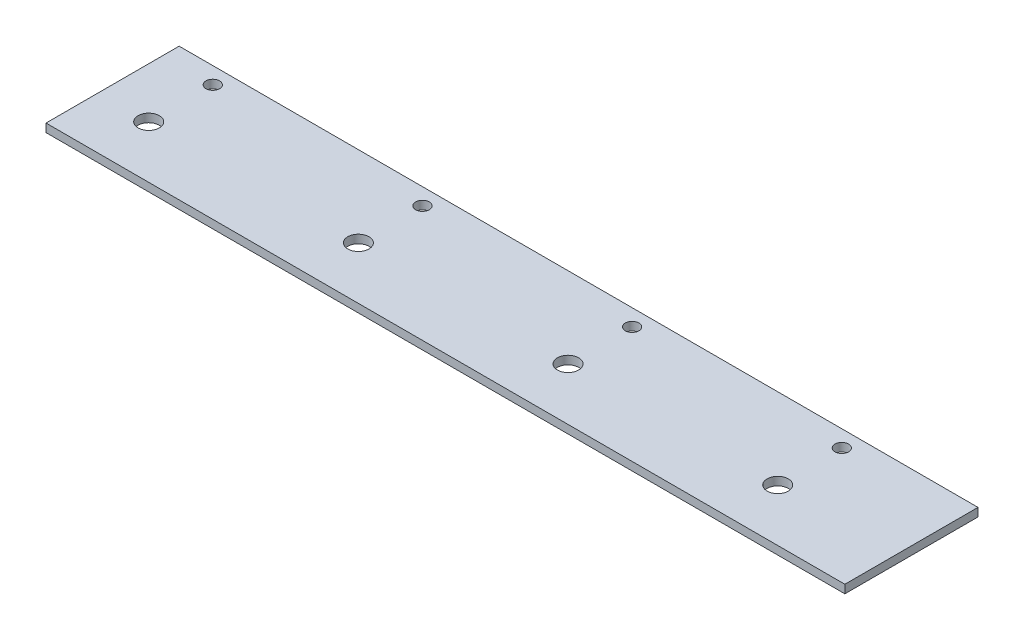
ISO-10303-21;
HEADER;
FILE_DESCRIPTION(('STEP AP214'),'2;1');
FILE_NAME('part.step','',(''),(''),'','','');
FILE_SCHEMA(('AUTOMOTIVE_DESIGN { 1 0 10303 214 1 1 1 1 }'));
ENDSEC;
DATA;
#1=APPLICATION_CONTEXT('core data for automotive mechanical design processes');
#2=APPLICATION_PROTOCOL_DEFINITION('international standard','automotive_design',2000,#1);
#3=PRODUCT_CONTEXT('',#1,'mechanical');
#4=PRODUCT('Part','Part','',(#3));
#5=PRODUCT_RELATED_PRODUCT_CATEGORY('part','',(#4));
#6=PRODUCT_DEFINITION_FORMATION('','',#4);
#7=PRODUCT_DEFINITION_CONTEXT('part definition',#1,'design');
#8=PRODUCT_DEFINITION('design','',#6,#7);
#9=PRODUCT_DEFINITION_SHAPE('','',#8);
#10=(LENGTH_UNIT() NAMED_UNIT(*) SI_UNIT(.MILLI.,.METRE.));
#11=(NAMED_UNIT(*) PLANE_ANGLE_UNIT() SI_UNIT($,.RADIAN.));
#12=(NAMED_UNIT(*) SI_UNIT($,.STERADIAN.) SOLID_ANGLE_UNIT());
#13=UNCERTAINTY_MEASURE_WITH_UNIT(LENGTH_MEASURE(1.E-05),#10,'distance_accuracy_value','');
#14=(GEOMETRIC_REPRESENTATION_CONTEXT(3) GLOBAL_UNCERTAINTY_ASSIGNED_CONTEXT((#13)) GLOBAL_UNIT_ASSIGNED_CONTEXT((#10,
#11,#12)) REPRESENTATION_CONTEXT('',''));
#15=CARTESIAN_POINT('',(0.,0.,0.));
#16=DIRECTION('',(0.,0.,1.));
#17=DIRECTION('',(1.,0.,0.));
#18=AXIS2_PLACEMENT_3D('',#15,#16,#17);
#19=CARTESIAN_POINT('',(0.,3.175,0.));
#20=DIRECTION('',(0.,-1.,0.));
#21=DIRECTION('',(0.,0.,-1.));
#22=AXIS2_PLACEMENT_3D('',#19,#20,#21);
#23=PLANE('',#22);
#24=DIRECTION('',(0.,0.,1.));
#25=VECTOR('',#24,1.);
#26=CARTESIAN_POINT('',(0.,3.175,0.));
#27=LINE('',#26,#25);
#28=CARTESIAN_POINT('',(0.,3.175,-50.8));
#29=VERTEX_POINT('',#28);
#30=CARTESIAN_POINT('',(0.,3.175,0.));
#31=VERTEX_POINT('',#30);
#32=EDGE_CURVE('E85',#29,#31,#27,.T.);
#33=ORIENTED_EDGE('',*,*,#32,.T.);
#34=DIRECTION('',(1.,0.,0.));
#35=VECTOR('',#34,1.);
#36=CARTESIAN_POINT('',(0.,3.175,0.));
#37=LINE('',#36,#35);
#38=CARTESIAN_POINT('',(304.8,3.175,0.));
#39=VERTEX_POINT('',#38);
#40=EDGE_CURVE('E80',#31,#39,#37,.T.);
#41=ORIENTED_EDGE('',*,*,#40,.T.);
#42=DIRECTION('',(0.,0.,-1.));
#43=VECTOR('',#42,1.);
#44=CARTESIAN_POINT('',(304.8,3.175,0.));
#45=LINE('',#44,#43);
#46=CARTESIAN_POINT('',(304.8,3.175,-50.8));
#47=VERTEX_POINT('',#46);
#48=EDGE_CURVE('E83',#39,#47,#45,.T.);
#49=ORIENTED_EDGE('',*,*,#48,.T.);
#50=DIRECTION('',(-1.,0.,0.));
#51=VECTOR('',#50,1.);
#52=CARTESIAN_POINT('',(0.,3.175,-50.8));
#53=LINE('',#52,#51);
#54=EDGE_CURVE('E50',#47,#29,#53,.T.);
#55=ORIENTED_EDGE('',*,*,#54,.T.);
#56=EDGE_LOOP('',(#33,#41,#49,#55));
#57=FACE_BOUND('',#56,.T.);
#58=CARTESIAN_POINT('',(19.1851278989688,3.175,-44.45));
#59=DIRECTION('',(0.,1.,0.));
#60=DIRECTION('',(0.,0.,1.));
#61=AXIS2_PLACEMENT_3D('',#58,#59,#60);
#62=CIRCLE('',#61,2.6);
#63=CARTESIAN_POINT('',(19.1851278989688,3.175,-41.85));
#64=VERTEX_POINT('',#63);
#65=EDGE_CURVE('E100',#64,#64,#62,.T.);
#66=ORIENTED_EDGE('',*,*,#65,.F.);
#67=EDGE_LOOP('',(#66));
#68=FACE_BOUND('',#67,.T.);
#69=CARTESIAN_POINT('',(19.1851278989688,3.175,-20.));
#70=DIRECTION('',(0.,1.,0.));
#71=DIRECTION('',(0.,0.,1.));
#72=AXIS2_PLACEMENT_3D('',#69,#70,#71);
#73=CIRCLE('',#72,4.05);
#74=CARTESIAN_POINT('',(19.1851278989688,3.175,-15.95));
#75=VERTEX_POINT('',#74);
#76=EDGE_CURVE('E115',#75,#75,#73,.T.);
#77=ORIENTED_EDGE('',*,*,#76,.F.);
#78=EDGE_LOOP('',(#77));
#79=FACE_BOUND('',#78,.T.);
#80=CARTESIAN_POINT('',(99.1851278989688,3.175,-44.45));
#81=DIRECTION('',(0.,1.,0.));
#82=DIRECTION('',(0.,0.,1.));
#83=AXIS2_PLACEMENT_3D('',#80,#81,#82);
#84=CIRCLE('',#83,2.6);
#85=CARTESIAN_POINT('',(99.1851278989688,3.175,-41.85));
#86=VERTEX_POINT('',#85);
#87=EDGE_CURVE('E121',#86,#86,#84,.T.);
#88=ORIENTED_EDGE('',*,*,#87,.F.);
#89=EDGE_LOOP('',(#88));
#90=FACE_BOUND('',#89,.T.);
#91=CARTESIAN_POINT('',(99.1851278989688,3.175,-20.));
#92=DIRECTION('',(0.,1.,0.));
#93=DIRECTION('',(0.,0.,1.));
#94=AXIS2_PLACEMENT_3D('',#91,#92,#93);
#95=CIRCLE('',#94,4.04999999999999);
#96=CARTESIAN_POINT('',(99.1851278989688,3.175,-15.95));
#97=VERTEX_POINT('',#96);
#98=EDGE_CURVE('E127',#97,#97,#95,.T.);
#99=ORIENTED_EDGE('',*,*,#98,.F.);
#100=EDGE_LOOP('',(#99));
#101=FACE_BOUND('',#100,.T.);
#102=CARTESIAN_POINT('',(179.185127898969,3.175,-44.45));
#103=DIRECTION('',(0.,1.,0.));
#104=DIRECTION('',(0.,0.,1.));
#105=AXIS2_PLACEMENT_3D('',#102,#103,#104);
#106=CIRCLE('',#105,2.59999999999999);
#107=CARTESIAN_POINT('',(179.185127898969,3.175,-41.85));
#108=VERTEX_POINT('',#107);
#109=EDGE_CURVE('E133',#108,#108,#106,.T.);
#110=ORIENTED_EDGE('',*,*,#109,.F.);
#111=EDGE_LOOP('',(#110));
#112=FACE_BOUND('',#111,.T.);
#113=CARTESIAN_POINT('',(179.185127898969,3.175,-20.));
#114=DIRECTION('',(0.,1.,0.));
#115=DIRECTION('',(0.,0.,1.));
#116=AXIS2_PLACEMENT_3D('',#113,#114,#115);
#117=CIRCLE('',#116,4.04999999999999);
#118=CARTESIAN_POINT('',(179.185127898969,3.175,-15.95));
#119=VERTEX_POINT('',#118);
#120=EDGE_CURVE('E139',#119,#119,#117,.T.);
#121=ORIENTED_EDGE('',*,*,#120,.F.);
#122=EDGE_LOOP('',(#121));
#123=FACE_BOUND('',#122,.T.);
#124=CARTESIAN_POINT('',(259.185127898969,3.175,-44.45));
#125=DIRECTION('',(0.,1.,0.));
#126=DIRECTION('',(0.,0.,1.));
#127=AXIS2_PLACEMENT_3D('',#124,#125,#126);
#128=CIRCLE('',#127,2.60000000000002);
#129=CARTESIAN_POINT('',(259.185127898969,3.175,-41.85));
#130=VERTEX_POINT('',#129);
#131=EDGE_CURVE('E145',#130,#130,#128,.T.);
#132=ORIENTED_EDGE('',*,*,#131,.F.);
#133=EDGE_LOOP('',(#132));
#134=FACE_BOUND('',#133,.T.);
#135=CARTESIAN_POINT('',(259.185127898969,3.175,-20.));
#136=DIRECTION('',(0.,1.,0.));
#137=DIRECTION('',(0.,0.,1.));
#138=AXIS2_PLACEMENT_3D('',#135,#136,#137);
#139=CIRCLE('',#138,4.05000000000002);
#140=CARTESIAN_POINT('',(259.185127898969,3.175,-15.95));
#141=VERTEX_POINT('',#140);
#142=EDGE_CURVE('E151',#141,#141,#139,.T.);
#143=ORIENTED_EDGE('',*,*,#142,.F.);
#144=EDGE_LOOP('',(#143));
#145=FACE_BOUND('',#144,.T.);
#146=ADVANCED_FACE('F33',(#57,#68,#79,#90,#101,#112,#123,#134,#145),#23,.F.);
#147=CARTESIAN_POINT('',(0.,0.,0.));
#148=DIRECTION('',(0.,-1.,0.));
#149=DIRECTION('',(0.,0.,-1.));
#150=AXIS2_PLACEMENT_3D('',#147,#148,#149);
#151=PLANE('',#150);
#152=CARTESIAN_POINT('',(259.185127898969,0.,-44.45));
#153=DIRECTION('',(0.,1.,0.));
#154=DIRECTION('',(0.,0.,1.));
#155=AXIS2_PLACEMENT_3D('',#152,#153,#154);
#156=CIRCLE('',#155,2.60000000000002);
#157=CARTESIAN_POINT('',(259.185127898969,0.,-41.85));
#158=VERTEX_POINT('',#157);
#159=EDGE_CURVE('E148',#158,#158,#156,.T.);
#160=ORIENTED_EDGE('',*,*,#159,.T.);
#161=EDGE_LOOP('',(#160));
#162=FACE_BOUND('',#161,.T.);
#163=CARTESIAN_POINT('',(179.185127898969,0.,-44.45));
#164=DIRECTION('',(0.,1.,0.));
#165=DIRECTION('',(0.,0.,1.));
#166=AXIS2_PLACEMENT_3D('',#163,#164,#165);
#167=CIRCLE('',#166,2.59999999999999);
#168=CARTESIAN_POINT('',(179.185127898969,0.,-41.85));
#169=VERTEX_POINT('',#168);
#170=EDGE_CURVE('E136',#169,#169,#167,.T.);
#171=ORIENTED_EDGE('',*,*,#170,.T.);
#172=EDGE_LOOP('',(#171));
#173=FACE_BOUND('',#172,.T.);
#174=CARTESIAN_POINT('',(99.1851278989688,0.,-44.45));
#175=DIRECTION('',(0.,1.,0.));
#176=DIRECTION('',(0.,0.,1.));
#177=AXIS2_PLACEMENT_3D('',#174,#175,#176);
#178=CIRCLE('',#177,2.6);
#179=CARTESIAN_POINT('',(99.1851278989688,0.,-41.85));
#180=VERTEX_POINT('',#179);
#181=EDGE_CURVE('E124',#180,#180,#178,.T.);
#182=ORIENTED_EDGE('',*,*,#181,.T.);
#183=EDGE_LOOP('',(#182));
#184=FACE_BOUND('',#183,.T.);
#185=CARTESIAN_POINT('',(19.1851278989688,0.,-44.45));
#186=DIRECTION('',(0.,1.,0.));
#187=DIRECTION('',(0.,0.,1.));
#188=AXIS2_PLACEMENT_3D('',#185,#186,#187);
#189=CIRCLE('',#188,2.6);
#190=CARTESIAN_POINT('',(19.1851278989688,0.,-41.85));
#191=VERTEX_POINT('',#190);
#192=EDGE_CURVE('E112',#191,#191,#189,.T.);
#193=ORIENTED_EDGE('',*,*,#192,.T.);
#194=EDGE_LOOP('',(#193));
#195=FACE_BOUND('',#194,.T.);
#196=DIRECTION('',(0.,0.,1.));
#197=VECTOR('',#196,1.);
#198=CARTESIAN_POINT('',(0.,0.,0.));
#199=LINE('',#198,#197);
#200=CARTESIAN_POINT('',(0.,0.,-50.8));
#201=VERTEX_POINT('',#200);
#202=CARTESIAN_POINT('',(0.,0.,0.));
#203=VERTEX_POINT('',#202);
#204=EDGE_CURVE('E97',#201,#203,#199,.T.);
#205=ORIENTED_EDGE('',*,*,#204,.F.);
#206=DIRECTION('',(-1.,0.,0.));
#207=VECTOR('',#206,1.);
#208=CARTESIAN_POINT('',(0.,0.,-50.8));
#209=LINE('',#208,#207);
#210=CARTESIAN_POINT('',(304.8,0.,-50.8));
#211=VERTEX_POINT('',#210);
#212=EDGE_CURVE('E73',#211,#201,#209,.T.);
#213=ORIENTED_EDGE('',*,*,#212,.F.);
#214=DIRECTION('',(0.,0.,-1.));
#215=VECTOR('',#214,1.);
#216=CARTESIAN_POINT('',(304.8,0.,0.));
#217=LINE('',#216,#215);
#218=CARTESIAN_POINT('',(304.8,0.,0.));
#219=VERTEX_POINT('',#218);
#220=EDGE_CURVE('E67',#219,#211,#217,.T.);
#221=ORIENTED_EDGE('',*,*,#220,.F.);
#222=DIRECTION('',(1.,0.,0.));
#223=VECTOR('',#222,1.);
#224=CARTESIAN_POINT('',(0.,0.,0.));
#225=LINE('',#224,#223);
#226=EDGE_CURVE('E89',#203,#219,#225,.T.);
#227=ORIENTED_EDGE('',*,*,#226,.F.);
#228=EDGE_LOOP('',(#205,#213,#221,#227));
#229=FACE_BOUND('',#228,.T.);
#230=CARTESIAN_POINT('',(19.1851278989688,0.,-20.));
#231=DIRECTION('',(0.,1.,0.));
#232=DIRECTION('',(0.,0.,1.));
#233=AXIS2_PLACEMENT_3D('',#230,#231,#232);
#234=CIRCLE('',#233,4.05);
#235=CARTESIAN_POINT('',(19.1851278989688,0.,-15.95));
#236=VERTEX_POINT('',#235);
#237=EDGE_CURVE('E118',#236,#236,#234,.T.);
#238=ORIENTED_EDGE('',*,*,#237,.T.);
#239=EDGE_LOOP('',(#238));
#240=FACE_BOUND('',#239,.T.);
#241=CARTESIAN_POINT('',(99.1851278989688,0.,-20.));
#242=DIRECTION('',(0.,1.,0.));
#243=DIRECTION('',(0.,0.,1.));
#244=AXIS2_PLACEMENT_3D('',#241,#242,#243);
#245=CIRCLE('',#244,4.04999999999999);
#246=CARTESIAN_POINT('',(99.1851278989688,0.,-15.95));
#247=VERTEX_POINT('',#246);
#248=EDGE_CURVE('E130',#247,#247,#245,.T.);
#249=ORIENTED_EDGE('',*,*,#248,.T.);
#250=EDGE_LOOP('',(#249));
#251=FACE_BOUND('',#250,.T.);
#252=CARTESIAN_POINT('',(179.185127898969,0.,-20.));
#253=DIRECTION('',(0.,1.,0.));
#254=DIRECTION('',(0.,0.,1.));
#255=AXIS2_PLACEMENT_3D('',#252,#253,#254);
#256=CIRCLE('',#255,4.04999999999999);
#257=CARTESIAN_POINT('',(179.185127898969,0.,-15.95));
#258=VERTEX_POINT('',#257);
#259=EDGE_CURVE('E142',#258,#258,#256,.T.);
#260=ORIENTED_EDGE('',*,*,#259,.T.);
#261=EDGE_LOOP('',(#260));
#262=FACE_BOUND('',#261,.T.);
#263=CARTESIAN_POINT('',(259.185127898969,0.,-20.));
#264=DIRECTION('',(0.,1.,0.));
#265=DIRECTION('',(0.,0.,1.));
#266=AXIS2_PLACEMENT_3D('',#263,#264,#265);
#267=CIRCLE('',#266,4.05000000000002);
#268=CARTESIAN_POINT('',(259.185127898969,0.,-15.95));
#269=VERTEX_POINT('',#268);
#270=EDGE_CURVE('E154',#269,#269,#267,.T.);
#271=ORIENTED_EDGE('',*,*,#270,.T.);
#272=EDGE_LOOP('',(#271));
#273=FACE_BOUND('',#272,.T.);
#274=ADVANCED_FACE('F108',(#162,#173,#184,#195,#229,#240,#251,#262,#273),#151,.T.);
#275=CARTESIAN_POINT('',(0.,3.175,0.));
#276=DIRECTION('',(1.,0.,0.));
#277=DIRECTION('',(0.,0.,-1.));
#278=AXIS2_PLACEMENT_3D('',#275,#276,#277);
#279=PLANE('',#278);
#280=ORIENTED_EDGE('',*,*,#204,.T.);
#281=DIRECTION('',(0.,-1.,0.));
#282=VECTOR('',#281,1.);
#283=CARTESIAN_POINT('',(0.,3.175,0.));
#284=LINE('',#283,#282);
#285=EDGE_CURVE('E11',#31,#203,#284,.T.);
#286=ORIENTED_EDGE('',*,*,#285,.F.);
#287=ORIENTED_EDGE('',*,*,#32,.F.);
#288=DIRECTION('',(0.,-1.,0.));
#289=VECTOR('',#288,1.);
#290=CARTESIAN_POINT('',(0.,3.175,-50.8));
#291=LINE('',#290,#289);
#292=EDGE_CURVE('E93',#29,#201,#291,.T.);
#293=ORIENTED_EDGE('',*,*,#292,.T.);
#294=EDGE_LOOP('',(#280,#286,#287,#293));
#295=FACE_BOUND('',#294,.T.);
#296=ADVANCED_FACE('F35',(#295),#279,.F.);
#297=CARTESIAN_POINT('',(0.,3.175,0.));
#298=DIRECTION('',(0.,0.,-1.));
#299=DIRECTION('',(-1.,0.,0.));
#300=AXIS2_PLACEMENT_3D('',#297,#298,#299);
#301=PLANE('',#300);
#302=ORIENTED_EDGE('',*,*,#226,.T.);
#303=DIRECTION('',(0.,-1.,0.));
#304=VECTOR('',#303,1.);
#305=CARTESIAN_POINT('',(304.8,3.175,0.));
#306=LINE('',#305,#304);
#307=EDGE_CURVE('E42',#39,#219,#306,.T.);
#308=ORIENTED_EDGE('',*,*,#307,.F.);
#309=ORIENTED_EDGE('',*,*,#40,.F.);
#310=ORIENTED_EDGE('',*,*,#285,.T.);
#311=EDGE_LOOP('',(#302,#308,#309,#310));
#312=FACE_BOUND('',#311,.T.);
#313=ADVANCED_FACE('F88',(#312),#301,.F.);
#314=CARTESIAN_POINT('',(304.8,3.175,0.));
#315=DIRECTION('',(-1.,0.,0.));
#316=DIRECTION('',(0.,0.,1.));
#317=AXIS2_PLACEMENT_3D('',#314,#315,#316);
#318=PLANE('',#317);
#319=ORIENTED_EDGE('',*,*,#220,.T.);
#320=DIRECTION('',(0.,-1.,0.));
#321=VECTOR('',#320,1.);
#322=CARTESIAN_POINT('',(304.8,3.175,-50.8));
#323=LINE('',#322,#321);
#324=EDGE_CURVE('E90',#47,#211,#323,.T.);
#325=ORIENTED_EDGE('',*,*,#324,.F.);
#326=ORIENTED_EDGE('',*,*,#48,.F.);
#327=ORIENTED_EDGE('',*,*,#307,.T.);
#328=EDGE_LOOP('',(#319,#325,#326,#327));
#329=FACE_BOUND('',#328,.T.);
#330=ADVANCED_FACE('F91',(#329),#318,.F.);
#331=CARTESIAN_POINT('',(0.,3.175,-50.8));
#332=DIRECTION('',(0.,0.,1.));
#333=DIRECTION('',(1.,0.,0.));
#334=AXIS2_PLACEMENT_3D('',#331,#332,#333);
#335=PLANE('',#334);
#336=ORIENTED_EDGE('',*,*,#212,.T.);
#337=ORIENTED_EDGE('',*,*,#292,.F.);
#338=ORIENTED_EDGE('',*,*,#54,.F.);
#339=ORIENTED_EDGE('',*,*,#324,.T.);
#340=EDGE_LOOP('',(#336,#337,#338,#339));
#341=FACE_BOUND('',#340,.T.);
#342=ADVANCED_FACE('F105',(#341),#335,.F.);
#343=CARTESIAN_POINT('',(19.1851278989688,3.175,-44.45));
#344=DIRECTION('',(0.,-1.,0.));
#345=DIRECTION('',(0.,0.,-1.));
#346=AXIS2_PLACEMENT_3D('',#343,#344,#345);
#347=CYLINDRICAL_SURFACE('',#346,2.6);
#348=ORIENTED_EDGE('',*,*,#65,.T.);
#349=EDGE_LOOP('',(#348));
#350=FACE_BOUND('',#349,.T.);
#351=ORIENTED_EDGE('',*,*,#192,.F.);
#352=EDGE_LOOP('',(#351));
#353=FACE_BOUND('',#352,.T.);
#354=ADVANCED_FACE('F171',(#350,#353),#347,.F.);
#355=CARTESIAN_POINT('',(19.1851278989688,3.175,-20.));
#356=DIRECTION('',(0.,-1.,0.));
#357=DIRECTION('',(0.,0.,-1.));
#358=AXIS2_PLACEMENT_3D('',#355,#356,#357);
#359=CYLINDRICAL_SURFACE('',#358,4.05);
#360=ORIENTED_EDGE('',*,*,#76,.T.);
#361=EDGE_LOOP('',(#360));
#362=FACE_BOUND('',#361,.T.);
#363=ORIENTED_EDGE('',*,*,#237,.F.);
#364=EDGE_LOOP('',(#363));
#365=FACE_BOUND('',#364,.T.);
#366=ADVANCED_FACE('F217',(#362,#365),#359,.F.);
#367=CARTESIAN_POINT('',(99.1851278989688,3.175,-44.45));
#368=DIRECTION('',(0.,-1.,0.));
#369=DIRECTION('',(0.,0.,-1.));
#370=AXIS2_PLACEMENT_3D('',#367,#368,#369);
#371=CYLINDRICAL_SURFACE('',#370,2.6);
#372=ORIENTED_EDGE('',*,*,#87,.T.);
#373=EDGE_LOOP('',(#372));
#374=FACE_BOUND('',#373,.T.);
#375=ORIENTED_EDGE('',*,*,#181,.F.);
#376=EDGE_LOOP('',(#375));
#377=FACE_BOUND('',#376,.T.);
#378=ADVANCED_FACE('F225',(#374,#377),#371,.F.);
#379=CARTESIAN_POINT('',(99.1851278989688,3.175,-20.));
#380=DIRECTION('',(0.,-1.,0.));
#381=DIRECTION('',(0.,0.,-1.));
#382=AXIS2_PLACEMENT_3D('',#379,#380,#381);
#383=CYLINDRICAL_SURFACE('',#382,4.04999999999999);
#384=ORIENTED_EDGE('',*,*,#98,.T.);
#385=EDGE_LOOP('',(#384));
#386=FACE_BOUND('',#385,.T.);
#387=ORIENTED_EDGE('',*,*,#248,.F.);
#388=EDGE_LOOP('',(#387));
#389=FACE_BOUND('',#388,.T.);
#390=ADVANCED_FACE('F233',(#386,#389),#383,.F.);
#391=CARTESIAN_POINT('',(179.185127898969,3.175,-44.45));
#392=DIRECTION('',(0.,-1.,0.));
#393=DIRECTION('',(0.,0.,-1.));
#394=AXIS2_PLACEMENT_3D('',#391,#392,#393);
#395=CYLINDRICAL_SURFACE('',#394,2.59999999999999);
#396=ORIENTED_EDGE('',*,*,#109,.T.);
#397=EDGE_LOOP('',(#396));
#398=FACE_BOUND('',#397,.T.);
#399=ORIENTED_EDGE('',*,*,#170,.F.);
#400=EDGE_LOOP('',(#399));
#401=FACE_BOUND('',#400,.T.);
#402=ADVANCED_FACE('F242',(#398,#401),#395,.F.);
#403=CARTESIAN_POINT('',(179.185127898969,3.175,-20.));
#404=DIRECTION('',(0.,-1.,0.));
#405=DIRECTION('',(0.,0.,-1.));
#406=AXIS2_PLACEMENT_3D('',#403,#404,#405);
#407=CYLINDRICAL_SURFACE('',#406,4.04999999999999);
#408=ORIENTED_EDGE('',*,*,#120,.T.);
#409=EDGE_LOOP('',(#408));
#410=FACE_BOUND('',#409,.T.);
#411=ORIENTED_EDGE('',*,*,#259,.F.);
#412=EDGE_LOOP('',(#411));
#413=FACE_BOUND('',#412,.T.);
#414=ADVANCED_FACE('F251',(#410,#413),#407,.F.);
#415=CARTESIAN_POINT('',(259.185127898969,3.175,-44.45));
#416=DIRECTION('',(0.,-1.,0.));
#417=DIRECTION('',(0.,0.,-1.));
#418=AXIS2_PLACEMENT_3D('',#415,#416,#417);
#419=CYLINDRICAL_SURFACE('',#418,2.60000000000002);
#420=ORIENTED_EDGE('',*,*,#131,.T.);
#421=EDGE_LOOP('',(#420));
#422=FACE_BOUND('',#421,.T.);
#423=ORIENTED_EDGE('',*,*,#159,.F.);
#424=EDGE_LOOP('',(#423));
#425=FACE_BOUND('',#424,.T.);
#426=ADVANCED_FACE('F260',(#422,#425),#419,.F.);
#427=CARTESIAN_POINT('',(259.185127898969,3.175,-20.));
#428=DIRECTION('',(0.,-1.,0.));
#429=DIRECTION('',(0.,0.,-1.));
#430=AXIS2_PLACEMENT_3D('',#427,#428,#429);
#431=CYLINDRICAL_SURFACE('',#430,4.05000000000002);
#432=ORIENTED_EDGE('',*,*,#142,.T.);
#433=EDGE_LOOP('',(#432));
#434=FACE_BOUND('',#433,.T.);
#435=ORIENTED_EDGE('',*,*,#270,.F.);
#436=EDGE_LOOP('',(#435));
#437=FACE_BOUND('',#436,.T.);
#438=ADVANCED_FACE('F160',(#434,#437),#431,.F.);
#439=CLOSED_SHELL('',(#146,#274,#296,#313,#330,#342,#354,#366,#378,#390,#402,#414,#426,#438));
#440=MANIFOLD_SOLID_BREP('B2',#439);
#441=ADVANCED_BREP_SHAPE_REPRESENTATION('',(#18,#440),#14);
#442=SHAPE_DEFINITION_REPRESENTATION(#9,#441);
ENDSEC;
END-ISO-10303-21;
